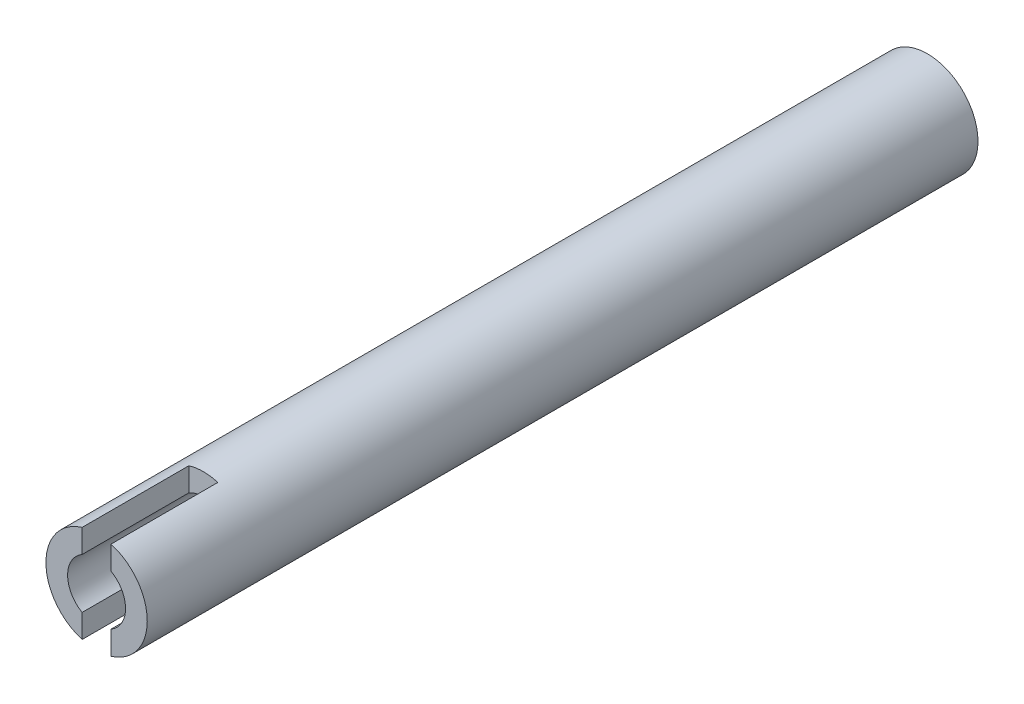
ISO-10303-21;
HEADER;
FILE_DESCRIPTION(('STEP AP214'),'2;1');
FILE_NAME('part.step','',(''),(''),'','','');
FILE_SCHEMA(('AUTOMOTIVE_DESIGN { 1 0 10303 214 1 1 1 1 }'));
ENDSEC;
DATA;
#1=APPLICATION_CONTEXT('core data for automotive mechanical design processes');
#2=APPLICATION_PROTOCOL_DEFINITION('international standard','automotive_design',2000,#1);
#3=PRODUCT_CONTEXT('',#1,'mechanical');
#4=PRODUCT('Part','Part','',(#3));
#5=PRODUCT_RELATED_PRODUCT_CATEGORY('part','',(#4));
#6=PRODUCT_DEFINITION_FORMATION('','',#4);
#7=PRODUCT_DEFINITION_CONTEXT('part definition',#1,'design');
#8=PRODUCT_DEFINITION('design','',#6,#7);
#9=PRODUCT_DEFINITION_SHAPE('','',#8);
#10=(LENGTH_UNIT() NAMED_UNIT(*) SI_UNIT(.MILLI.,.METRE.));
#11=(NAMED_UNIT(*) PLANE_ANGLE_UNIT() SI_UNIT($,.RADIAN.));
#12=(NAMED_UNIT(*) SI_UNIT($,.STERADIAN.) SOLID_ANGLE_UNIT());
#13=UNCERTAINTY_MEASURE_WITH_UNIT(LENGTH_MEASURE(1.E-05),#10,'distance_accuracy_value','');
#14=(GEOMETRIC_REPRESENTATION_CONTEXT(3) GLOBAL_UNCERTAINTY_ASSIGNED_CONTEXT((#13)) GLOBAL_UNIT_ASSIGNED_CONTEXT((#10,
#11,#12)) REPRESENTATION_CONTEXT('',''));
#15=CARTESIAN_POINT('',(0.,0.,0.));
#16=DIRECTION('',(0.,0.,1.));
#17=DIRECTION('',(1.,0.,0.));
#18=AXIS2_PLACEMENT_3D('',#15,#16,#17);
#19=CARTESIAN_POINT('',(0.,0.,-107.5));
#20=DIRECTION('',(0.,0.,1.));
#21=DIRECTION('',(1.,0.,0.));
#22=AXIS2_PLACEMENT_3D('',#19,#20,#21);
#23=CYLINDRICAL_SURFACE('',#22,7.);
#24=CARTESIAN_POINT('',(0.,0.,-107.5));
#25=DIRECTION('',(0.,0.,1.));
#26=DIRECTION('',(1.,0.,0.));
#27=AXIS2_PLACEMENT_3D('',#24,#25,#26);
#28=CIRCLE('',#27,7.);
#29=CARTESIAN_POINT('',(7.,0.,-107.5));
#30=VERTEX_POINT('',#29);
#31=EDGE_CURVE('E157',#30,#30,#28,.T.);
#32=ORIENTED_EDGE('',*,*,#31,.T.);
#33=EDGE_LOOP('',(#32));
#34=FACE_BOUND('',#33,.T.);
#35=CARTESIAN_POINT('',(0.,0.,7.25));
#36=DIRECTION('',(0.,0.,1.));
#37=DIRECTION('',(1.,0.,0.));
#38=AXIS2_PLACEMENT_3D('',#35,#36,#37);
#39=CIRCLE('',#38,7.);
#40=CARTESIAN_POINT('',(2.,-6.70820393249937,7.25));
#41=VERTEX_POINT('',#40);
#42=CARTESIAN_POINT('',(2.,6.70820393249937,7.25));
#43=VERTEX_POINT('',#42);
#44=EDGE_CURVE('E150',#41,#43,#39,.T.);
#45=ORIENTED_EDGE('',*,*,#44,.F.);
#46=DIRECTION('',(0.,0.,-1.));
#47=VECTOR('',#46,1.);
#48=CARTESIAN_POINT('',(2.,-6.70820393249937,22.060219778561));
#49=LINE('',#48,#47);
#50=CARTESIAN_POINT('',(2.,-6.70820393249937,-7.5));
#51=VERTEX_POINT('',#50);
#52=EDGE_CURVE('E126',#41,#51,#49,.T.);
#53=ORIENTED_EDGE('',*,*,#52,.T.);
#54=CARTESIAN_POINT('',(0.,0.,-7.5));
#55=DIRECTION('',(0.,0.,1.));
#56=DIRECTION('',(1.,0.,0.));
#57=AXIS2_PLACEMENT_3D('',#54,#55,#56);
#58=CIRCLE('',#57,7.);
#59=CARTESIAN_POINT('',(-2.,-6.70820393249937,-7.5));
#60=VERTEX_POINT('',#59);
#61=EDGE_CURVE('E115',#60,#51,#58,.T.);
#62=ORIENTED_EDGE('',*,*,#61,.F.);
#63=DIRECTION('',(0.,0.,-1.));
#64=VECTOR('',#63,1.);
#65=CARTESIAN_POINT('',(-2.,-6.70820393249937,22.060219778561));
#66=LINE('',#65,#64);
#67=CARTESIAN_POINT('',(-2.,-6.70820393249937,7.25));
#68=VERTEX_POINT('',#67);
#69=EDGE_CURVE('E106',#68,#60,#66,.T.);
#70=ORIENTED_EDGE('',*,*,#69,.F.);
#71=CARTESIAN_POINT('',(-2.,6.70820393249937,7.25));
#72=VERTEX_POINT('',#71);
#73=EDGE_CURVE('E153',#72,#68,#39,.T.);
#74=ORIENTED_EDGE('',*,*,#73,.F.);
#75=DIRECTION('',(0.,0.,-1.));
#76=VECTOR('',#75,1.);
#77=CARTESIAN_POINT('',(-2.,6.70820393249937,22.060219778561));
#78=LINE('',#77,#76);
#79=CARTESIAN_POINT('',(-2.,6.70820393249937,-7.5));
#80=VERTEX_POINT('',#79);
#81=EDGE_CURVE('E65',#72,#80,#78,.T.);
#82=ORIENTED_EDGE('',*,*,#81,.T.);
#83=CARTESIAN_POINT('',(0.,0.,-7.5));
#84=DIRECTION('',(0.,0.,1.));
#85=DIRECTION('',(1.,0.,0.));
#86=AXIS2_PLACEMENT_3D('',#83,#84,#85);
#87=CIRCLE('',#86,7.);
#88=CARTESIAN_POINT('',(2.,6.70820393249937,-7.5));
#89=VERTEX_POINT('',#88);
#90=EDGE_CURVE('E137',#89,#80,#87,.T.);
#91=ORIENTED_EDGE('',*,*,#90,.F.);
#92=DIRECTION('',(0.,0.,-1.));
#93=VECTOR('',#92,1.);
#94=CARTESIAN_POINT('',(2.,6.70820393249937,22.060219778561));
#95=LINE('',#94,#93);
#96=EDGE_CURVE('E134',#43,#89,#95,.T.);
#97=ORIENTED_EDGE('',*,*,#96,.F.);
#98=EDGE_LOOP('',(#45,#53,#62,#70,#74,#82,#91,#97));
#99=FACE_BOUND('',#98,.T.);
#100=ADVANCED_FACE('F43',(#34,#99),#23,.T.);
#101=CARTESIAN_POINT('',(0.,0.,-107.5));
#102=DIRECTION('',(0.,0.,1.));
#103=DIRECTION('',(1.,0.,0.));
#104=AXIS2_PLACEMENT_3D('',#101,#102,#103);
#105=CYLINDRICAL_SURFACE('',#104,4.);
#106=CARTESIAN_POINT('',(0.,0.,-107.5));
#107=DIRECTION('',(0.,0.,1.));
#108=DIRECTION('',(1.,0.,0.));
#109=AXIS2_PLACEMENT_3D('',#106,#107,#108);
#110=CIRCLE('',#109,4.);
#111=CARTESIAN_POINT('',(4.,0.,-107.5));
#112=VERTEX_POINT('',#111);
#113=EDGE_CURVE('E154',#112,#112,#110,.T.);
#114=ORIENTED_EDGE('',*,*,#113,.F.);
#115=EDGE_LOOP('',(#114));
#116=FACE_BOUND('',#115,.T.);
#117=DIRECTION('',(0.,0.,1.));
#118=VECTOR('',#117,1.);
#119=CARTESIAN_POINT('',(2.,-3.46410161513775,-107.5));
#120=LINE('',#119,#118);
#121=CARTESIAN_POINT('',(2.,-3.46410161513775,7.25));
#122=VERTEX_POINT('',#121);
#123=CARTESIAN_POINT('',(2.,-3.46410161513775,-7.50000000000001));
#124=VERTEX_POINT('',#123);
#125=EDGE_CURVE('E142',#122,#124,#120,.F.);
#126=ORIENTED_EDGE('',*,*,#125,.F.);
#127=CARTESIAN_POINT('',(0.,0.,7.25));
#128=DIRECTION('',(0.,0.,1.));
#129=DIRECTION('',(1.,0.,0.));
#130=AXIS2_PLACEMENT_3D('',#127,#128,#129);
#131=CIRCLE('',#130,4.);
#132=CARTESIAN_POINT('',(2.,3.46410161513775,7.25));
#133=VERTEX_POINT('',#132);
#134=EDGE_CURVE('E146',#122,#133,#131,.T.);
#135=ORIENTED_EDGE('',*,*,#134,.T.);
#136=DIRECTION('',(0.,0.,1.));
#137=VECTOR('',#136,1.);
#138=CARTESIAN_POINT('',(2.,3.46410161513775,-107.5));
#139=LINE('',#138,#137);
#140=CARTESIAN_POINT('',(2.,3.46410161513775,-7.50000000000001));
#141=VERTEX_POINT('',#140);
#142=EDGE_CURVE('E144',#141,#133,#139,.T.);
#143=ORIENTED_EDGE('',*,*,#142,.F.);
#144=CARTESIAN_POINT('',(0.,0.,-7.50000000000001));
#145=DIRECTION('',(0.,0.,1.));
#146=DIRECTION('',(1.,0.,0.));
#147=AXIS2_PLACEMENT_3D('',#144,#145,#146);
#148=CIRCLE('',#147,4.);
#149=CARTESIAN_POINT('',(-2.,3.46410161513775,-7.50000000000001));
#150=VERTEX_POINT('',#149);
#151=EDGE_CURVE('E46',#150,#141,#148,.F.);
#152=ORIENTED_EDGE('',*,*,#151,.F.);
#153=DIRECTION('',(0.,0.,1.));
#154=VECTOR('',#153,1.);
#155=CARTESIAN_POINT('',(-2.,3.46410161513775,-107.5));
#156=LINE('',#155,#154);
#157=CARTESIAN_POINT('',(-2.,3.46410161513775,7.25));
#158=VERTEX_POINT('',#157);
#159=EDGE_CURVE('E139',#158,#150,#156,.F.);
#160=ORIENTED_EDGE('',*,*,#159,.F.);
#161=CARTESIAN_POINT('',(-2.,-3.46410161513775,7.25));
#162=VERTEX_POINT('',#161);
#163=EDGE_CURVE('E149',#158,#162,#131,.T.);
#164=ORIENTED_EDGE('',*,*,#163,.T.);
#165=DIRECTION('',(0.,0.,1.));
#166=VECTOR('',#165,1.);
#167=CARTESIAN_POINT('',(-2.,-3.46410161513775,-107.5));
#168=LINE('',#167,#166);
#169=CARTESIAN_POINT('',(-2.,-3.46410161513775,-7.50000000000001));
#170=VERTEX_POINT('',#169);
#171=EDGE_CURVE('E57',#170,#162,#168,.T.);
#172=ORIENTED_EDGE('',*,*,#171,.F.);
#173=EDGE_CURVE('E11',#124,#170,#148,.F.);
#174=ORIENTED_EDGE('',*,*,#173,.F.);
#175=EDGE_LOOP('',(#126,#135,#143,#152,#160,#164,#172,#174));
#176=FACE_BOUND('',#175,.T.);
#177=ADVANCED_FACE('F174',(#116,#176),#105,.F.);
#178=CARTESIAN_POINT('',(0.,0.,7.25));
#179=DIRECTION('',(0.,0.,1.));
#180=DIRECTION('',(1.,0.,0.));
#181=AXIS2_PLACEMENT_3D('',#178,#179,#180);
#182=PLANE('',#181);
#183=ORIENTED_EDGE('',*,*,#44,.T.);
#184=DIRECTION('',(0.,-1.,0.));
#185=VECTOR('',#184,1.);
#186=CARTESIAN_POINT('',(2.,0.,7.25));
#187=LINE('',#186,#185);
#188=EDGE_CURVE('E163',#43,#133,#187,.T.);
#189=ORIENTED_EDGE('',*,*,#188,.T.);
#190=ORIENTED_EDGE('',*,*,#134,.F.);
#191=EDGE_CURVE('E161',#122,#41,#187,.T.);
#192=ORIENTED_EDGE('',*,*,#191,.T.);
#193=EDGE_LOOP('',(#183,#189,#190,#192));
#194=FACE_BOUND('',#193,.T.);
#195=ADVANCED_FACE('F185',(#194),#182,.T.);
#196=ORIENTED_EDGE('',*,*,#73,.T.);
#197=DIRECTION('',(0.,1.,0.));
#198=VECTOR('',#197,1.);
#199=CARTESIAN_POINT('',(-2.,0.,7.25));
#200=LINE('',#199,#198);
#201=EDGE_CURVE('E110',#68,#162,#200,.T.);
#202=ORIENTED_EDGE('',*,*,#201,.T.);
#203=ORIENTED_EDGE('',*,*,#163,.F.);
#204=EDGE_CURVE('E160',#158,#72,#200,.T.);
#205=ORIENTED_EDGE('',*,*,#204,.T.);
#206=EDGE_LOOP('',(#196,#202,#203,#205));
#207=FACE_BOUND('',#206,.T.);
#208=ADVANCED_FACE('F170',(#207),#182,.T.);
#209=CARTESIAN_POINT('',(0.,0.,-107.5));
#210=DIRECTION('',(0.,0.,1.));
#211=DIRECTION('',(1.,0.,0.));
#212=AXIS2_PLACEMENT_3D('',#209,#210,#211);
#213=PLANE('',#212);
#214=ORIENTED_EDGE('',*,*,#113,.T.);
#215=EDGE_LOOP('',(#214));
#216=FACE_BOUND('',#215,.T.);
#217=ORIENTED_EDGE('',*,*,#31,.F.);
#218=EDGE_LOOP('',(#217));
#219=FACE_BOUND('',#218,.T.);
#220=ADVANCED_FACE('F200',(#216,#219),#213,.F.);
#221=CARTESIAN_POINT('',(2.,-6.70820393249937,22.060219778561));
#222=DIRECTION('',(-1.,0.,0.));
#223=DIRECTION('',(0.,0.,1.));
#224=AXIS2_PLACEMENT_3D('',#221,#222,#223);
#225=PLANE('',#224);
#226=ORIENTED_EDGE('',*,*,#142,.T.);
#227=ORIENTED_EDGE('',*,*,#188,.F.);
#228=ORIENTED_EDGE('',*,*,#96,.T.);
#229=DIRECTION('',(0.,1.,0.));
#230=VECTOR('',#229,1.);
#231=CARTESIAN_POINT('',(2.,-6.70820393249937,-7.5));
#232=LINE('',#231,#230);
#233=EDGE_CURVE('E128',#141,#89,#232,.T.);
#234=ORIENTED_EDGE('',*,*,#233,.F.);
#235=EDGE_LOOP('',(#226,#227,#228,#234));
#236=FACE_BOUND('',#235,.T.);
#237=ADVANCED_FACE('F190',(#236),#225,.T.);
#238=CARTESIAN_POINT('',(-2.,-6.70820393249937,22.060219778561));
#239=DIRECTION('',(1.,0.,0.));
#240=DIRECTION('',(0.,0.,-1.));
#241=AXIS2_PLACEMENT_3D('',#238,#239,#240);
#242=PLANE('',#241);
#243=ORIENTED_EDGE('',*,*,#159,.T.);
#244=DIRECTION('',(0.,-1.,0.));
#245=VECTOR('',#244,1.);
#246=CARTESIAN_POINT('',(-2.,-6.70820393249937,-7.5));
#247=LINE('',#246,#245);
#248=EDGE_CURVE('E123',#80,#150,#247,.T.);
#249=ORIENTED_EDGE('',*,*,#248,.F.);
#250=ORIENTED_EDGE('',*,*,#81,.F.);
#251=ORIENTED_EDGE('',*,*,#204,.F.);
#252=EDGE_LOOP('',(#243,#249,#250,#251));
#253=FACE_BOUND('',#252,.T.);
#254=ADVANCED_FACE('F178',(#253),#242,.T.);
#255=CARTESIAN_POINT('',(0.,0.,-7.5));
#256=DIRECTION('',(0.,0.,1.));
#257=DIRECTION('',(1.,0.,0.));
#258=AXIS2_PLACEMENT_3D('',#255,#256,#257);
#259=PLANE('',#258);
#260=ORIENTED_EDGE('',*,*,#151,.T.);
#261=ORIENTED_EDGE('',*,*,#233,.T.);
#262=ORIENTED_EDGE('',*,*,#90,.T.);
#263=ORIENTED_EDGE('',*,*,#248,.T.);
#264=EDGE_LOOP('',(#260,#261,#262,#263));
#265=FACE_BOUND('',#264,.T.);
#266=ADVANCED_FACE('F180',(#265),#259,.T.);
#267=ORIENTED_EDGE('',*,*,#173,.T.);
#268=EDGE_CURVE('E109',#170,#60,#247,.T.);
#269=ORIENTED_EDGE('',*,*,#268,.T.);
#270=ORIENTED_EDGE('',*,*,#61,.T.);
#271=EDGE_CURVE('E131',#51,#124,#232,.T.);
#272=ORIENTED_EDGE('',*,*,#271,.T.);
#273=EDGE_LOOP('',(#267,#269,#270,#272));
#274=FACE_BOUND('',#273,.T.);
#275=ADVANCED_FACE('F119',(#274),#259,.T.);
#276=ORIENTED_EDGE('',*,*,#125,.T.);
#277=ORIENTED_EDGE('',*,*,#271,.F.);
#278=ORIENTED_EDGE('',*,*,#52,.F.);
#279=ORIENTED_EDGE('',*,*,#191,.F.);
#280=EDGE_LOOP('',(#276,#277,#278,#279));
#281=FACE_BOUND('',#280,.T.);
#282=ADVANCED_FACE('F187',(#281),#225,.T.);
#283=ORIENTED_EDGE('',*,*,#171,.T.);
#284=ORIENTED_EDGE('',*,*,#201,.F.);
#285=ORIENTED_EDGE('',*,*,#69,.T.);
#286=ORIENTED_EDGE('',*,*,#268,.F.);
#287=EDGE_LOOP('',(#283,#284,#285,#286));
#288=FACE_BOUND('',#287,.T.);
#289=ADVANCED_FACE('F108',(#288),#242,.T.);
#290=CLOSED_SHELL('',(#100,#177,#195,#208,#220,#237,#254,#266,#275,#282,#289));
#291=MANIFOLD_SOLID_BREP('B2',#290);
#292=ADVANCED_BREP_SHAPE_REPRESENTATION('',(#18,#291),#14);
#293=SHAPE_DEFINITION_REPRESENTATION(#9,#292);
ENDSEC;
END-ISO-10303-21;
